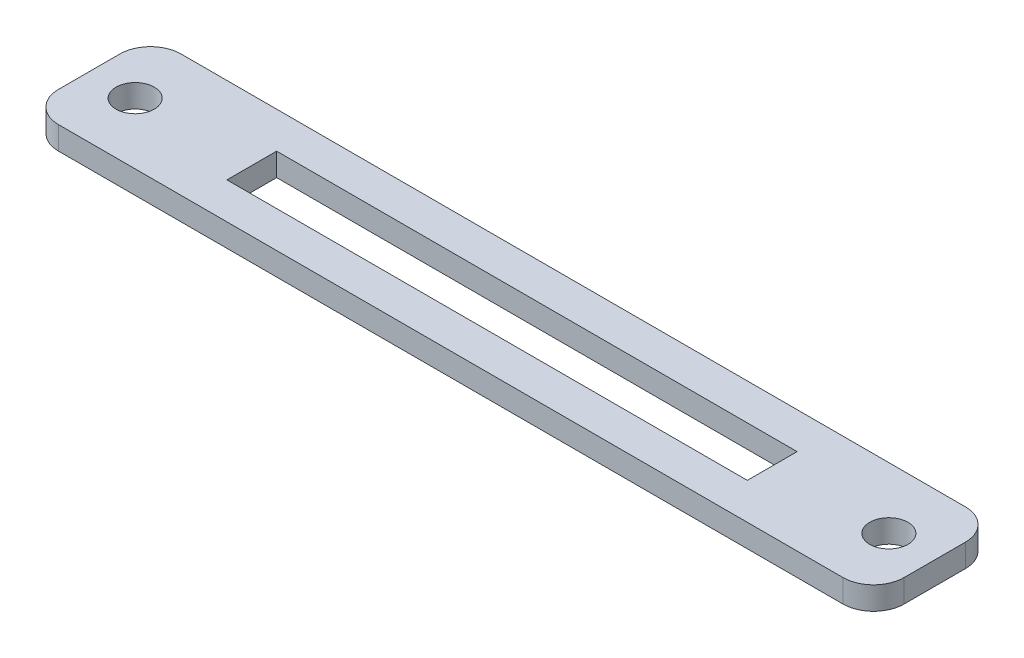
ISO-10303-21;
HEADER;
FILE_DESCRIPTION(('STEP AP214'),'2;1');
FILE_NAME('part.step','',(''),(''),'','','');
FILE_SCHEMA(('AUTOMOTIVE_DESIGN { 1 0 10303 214 1 1 1 1 }'));
ENDSEC;
DATA;
#1=APPLICATION_CONTEXT('core data for automotive mechanical design processes');
#2=APPLICATION_PROTOCOL_DEFINITION('international standard','automotive_design',2000,#1);
#3=PRODUCT_CONTEXT('',#1,'mechanical');
#4=PRODUCT('Part','Part','',(#3));
#5=PRODUCT_RELATED_PRODUCT_CATEGORY('part','',(#4));
#6=PRODUCT_DEFINITION_FORMATION('','',#4);
#7=PRODUCT_DEFINITION_CONTEXT('part definition',#1,'design');
#8=PRODUCT_DEFINITION('design','',#6,#7);
#9=PRODUCT_DEFINITION_SHAPE('','',#8);
#10=(LENGTH_UNIT() NAMED_UNIT(*) SI_UNIT(.MILLI.,.METRE.));
#11=(NAMED_UNIT(*) PLANE_ANGLE_UNIT() SI_UNIT($,.RADIAN.));
#12=(NAMED_UNIT(*) SI_UNIT($,.STERADIAN.) SOLID_ANGLE_UNIT());
#13=UNCERTAINTY_MEASURE_WITH_UNIT(LENGTH_MEASURE(1.E-05),#10,'distance_accuracy_value','');
#14=(GEOMETRIC_REPRESENTATION_CONTEXT(3) GLOBAL_UNCERTAINTY_ASSIGNED_CONTEXT((#13)) GLOBAL_UNIT_ASSIGNED_CONTEXT((#10,
#11,#12)) REPRESENTATION_CONTEXT('',''));
#15=CARTESIAN_POINT('',(0.,0.,0.));
#16=DIRECTION('',(0.,0.,1.));
#17=DIRECTION('',(1.,0.,0.));
#18=AXIS2_PLACEMENT_3D('',#15,#16,#17);
#19=CARTESIAN_POINT('',(0.,-1.5,-7.99999999999999));
#20=DIRECTION('',(0.,0.,-1.));
#21=DIRECTION('',(-1.,0.,0.));
#22=AXIS2_PLACEMENT_3D('',#19,#20,#21);
#23=PLANE('',#22);
#24=DIRECTION('',(-1.,0.,0.));
#25=VECTOR('',#24,1.);
#26=CARTESIAN_POINT('',(0.,-1.5,-7.99999999999999));
#27=LINE('',#26,#25);
#28=CARTESIAN_POINT('',(44.1199111843078,-1.5,-7.99999999999999));
#29=VERTEX_POINT('',#28);
#30=CARTESIAN_POINT('',(-7.11991118430777,-1.5,-7.99999999999999));
#31=VERTEX_POINT('',#30);
#32=EDGE_CURVE('E223',#29,#31,#27,.T.);
#33=ORIENTED_EDGE('',*,*,#32,.T.);
#34=DIRECTION('',(0.,-1.,0.));
#35=VECTOR('',#34,1.);
#36=CARTESIAN_POINT('',(-7.11991118430776,0.,-7.99999999999999));
#37=LINE('',#36,#35);
#38=CARTESIAN_POINT('',(-7.11991118430776,0.,-7.99999999999999));
#39=VERTEX_POINT('',#38);
#40=EDGE_CURVE('E246',#31,#39,#37,.F.);
#41=ORIENTED_EDGE('',*,*,#40,.T.);
#42=DIRECTION('',(-1.,0.,0.));
#43=VECTOR('',#42,1.);
#44=CARTESIAN_POINT('',(0.,0.,-7.99999999999999));
#45=LINE('',#44,#43);
#46=CARTESIAN_POINT('',(44.1199111843077,0.,-7.99999999999999));
#47=VERTEX_POINT('',#46);
#48=EDGE_CURVE('E224',#47,#39,#45,.T.);
#49=ORIENTED_EDGE('',*,*,#48,.F.);
#50=DIRECTION('',(0.,-1.,0.));
#51=VECTOR('',#50,1.);
#52=CARTESIAN_POINT('',(44.1199111843078,-1.49999999999998,-8.));
#53=LINE('',#52,#51);
#54=EDGE_CURVE('E243',#47,#29,#53,.T.);
#55=ORIENTED_EDGE('',*,*,#54,.T.);
#56=EDGE_LOOP('',(#33,#41,#49,#55));
#57=FACE_BOUND('',#56,.T.);
#58=ADVANCED_FACE('F82',(#57),#23,.T.);
#59=CARTESIAN_POINT('',(0.,-1.5,0.));
#60=DIRECTION('',(0.,0.,1.));
#61=DIRECTION('',(1.,0.,0.));
#62=AXIS2_PLACEMENT_3D('',#59,#60,#61);
#63=PLANE('',#62);
#64=DIRECTION('',(1.,0.,0.));
#65=VECTOR('',#64,1.);
#66=CARTESIAN_POINT('',(0.,0.,0.));
#67=LINE('',#66,#65);
#68=CARTESIAN_POINT('',(-7.11991118430776,0.,0.));
#69=VERTEX_POINT('',#68);
#70=CARTESIAN_POINT('',(44.1199111843077,0.,0.));
#71=VERTEX_POINT('',#70);
#72=EDGE_CURVE('E216',#69,#71,#67,.T.);
#73=ORIENTED_EDGE('',*,*,#72,.F.);
#74=DIRECTION('',(0.,-1.,0.));
#75=VECTOR('',#74,1.);
#76=CARTESIAN_POINT('',(-7.11991118430777,-1.49999999999998,0.));
#77=LINE('',#76,#75);
#78=CARTESIAN_POINT('',(-7.11991118430777,-1.5,0.));
#79=VERTEX_POINT('',#78);
#80=EDGE_CURVE('E257',#69,#79,#77,.T.);
#81=ORIENTED_EDGE('',*,*,#80,.T.);
#82=DIRECTION('',(1.,0.,0.));
#83=VECTOR('',#82,1.);
#84=CARTESIAN_POINT('',(0.,-1.5,0.));
#85=LINE('',#84,#83);
#86=CARTESIAN_POINT('',(44.1199111843078,-1.5,0.));
#87=VERTEX_POINT('',#86);
#88=EDGE_CURVE('E220',#79,#87,#85,.T.);
#89=ORIENTED_EDGE('',*,*,#88,.T.);
#90=DIRECTION('',(0.,-1.,0.));
#91=VECTOR('',#90,1.);
#92=CARTESIAN_POINT('',(44.1199111843077,0.,0.));
#93=LINE('',#92,#91);
#94=EDGE_CURVE('E255',#87,#71,#93,.F.);
#95=ORIENTED_EDGE('',*,*,#94,.T.);
#96=EDGE_LOOP('',(#73,#81,#89,#95));
#97=FACE_BOUND('',#96,.T.);
#98=ADVANCED_FACE('F263',(#97),#63,.T.);
#99=CARTESIAN_POINT('',(0.,-1.5,0.));
#100=DIRECTION('',(0.,-1.,0.));
#101=DIRECTION('',(0.,0.,-1.));
#102=AXIS2_PLACEMENT_3D('',#99,#100,#101);
#103=PLANE('',#102);
#104=DIRECTION('',(0.,0.,-1.));
#105=VECTOR('',#104,1.);
#106=CARTESIAN_POINT('',(35.5,-1.5,-5.62499999999999));
#107=LINE('',#106,#105);
#108=CARTESIAN_POINT('',(35.5,-1.5,-2.37499999999999));
#109=VERTEX_POINT('',#108);
#110=CARTESIAN_POINT('',(35.5,-1.5,-5.62499999999999));
#111=VERTEX_POINT('',#110);
#112=EDGE_CURVE('E176',#109,#111,#107,.T.);
#113=ORIENTED_EDGE('',*,*,#112,.T.);
#114=DIRECTION('',(-1.,0.,0.));
#115=VECTOR('',#114,1.);
#116=CARTESIAN_POINT('',(1.49999999999999,-1.5,-5.62499999999999));
#117=LINE('',#116,#115);
#118=CARTESIAN_POINT('',(1.49999999999999,-1.5,-5.62499999999999));
#119=VERTEX_POINT('',#118);
#120=EDGE_CURVE('E188',#111,#119,#117,.T.);
#121=ORIENTED_EDGE('',*,*,#120,.T.);
#122=DIRECTION('',(0.,0.,1.));
#123=VECTOR('',#122,1.);
#124=CARTESIAN_POINT('',(1.49999999999999,-1.5,-5.62499999999999));
#125=LINE('',#124,#123);
#126=CARTESIAN_POINT('',(1.49999999999999,-1.5,-2.37499999999999));
#127=VERTEX_POINT('',#126);
#128=EDGE_CURVE('E192',#119,#127,#125,.T.);
#129=ORIENTED_EDGE('',*,*,#128,.T.);
#130=DIRECTION('',(1.,0.,0.));
#131=VECTOR('',#130,1.);
#132=CARTESIAN_POINT('',(1.49999999999999,-1.5,-2.37499999999999));
#133=LINE('',#132,#131);
#134=EDGE_CURVE('E184',#127,#109,#133,.T.);
#135=ORIENTED_EDGE('',*,*,#134,.T.);
#136=EDGE_LOOP('',(#113,#121,#129,#135));
#137=FACE_BOUND('',#136,.T.);
#138=DIRECTION('',(0.,0.,-1.));
#139=VECTOR('',#138,1.);
#140=CARTESIAN_POINT('',(-9.11991118430777,-1.49999999999996,0.));
#141=LINE('',#140,#139);
#142=CARTESIAN_POINT('',(-9.11991118430777,-1.49999999999996,-5.99999999999999));
#143=VERTEX_POINT('',#142);
#144=CARTESIAN_POINT('',(-9.11991118430777,-1.49999999999996,-2.));
#145=VERTEX_POINT('',#144);
#146=EDGE_CURVE('E282',#143,#145,#141,.F.);
#147=ORIENTED_EDGE('',*,*,#146,.F.);
#148=CARTESIAN_POINT('',(-7.11991118430777,-1.5,-5.99999999999999));
#149=DIRECTION('',(0.,-1.,0.));
#150=DIRECTION('',(0.,0.,-1.));
#151=AXIS2_PLACEMENT_3D('',#148,#149,#150);
#152=CIRCLE('',#151,2.);
#153=EDGE_CURVE('E241',#143,#31,#152,.T.);
#154=ORIENTED_EDGE('',*,*,#153,.T.);
#155=ORIENTED_EDGE('',*,*,#32,.F.);
#156=CARTESIAN_POINT('',(44.1199111843078,-1.5,-6.));
#157=DIRECTION('',(0.,-1.,0.));
#158=DIRECTION('',(0.,0.,-1.));
#159=AXIS2_PLACEMENT_3D('',#156,#157,#158);
#160=CIRCLE('',#159,2.);
#161=CARTESIAN_POINT('',(46.1199111843078,-1.49999999999997,-6.));
#162=VERTEX_POINT('',#161);
#163=EDGE_CURVE('E235',#29,#162,#160,.T.);
#164=ORIENTED_EDGE('',*,*,#163,.T.);
#165=DIRECTION('',(0.,0.,1.));
#166=VECTOR('',#165,1.);
#167=CARTESIAN_POINT('',(46.1199111843078,-1.49999999999997,-8.));
#168=LINE('',#167,#166);
#169=CARTESIAN_POINT('',(46.1199111843078,-1.49999999999997,-1.99999999999999));
#170=VERTEX_POINT('',#169);
#171=EDGE_CURVE('E203',#170,#162,#168,.F.);
#172=ORIENTED_EDGE('',*,*,#171,.F.);
#173=CARTESIAN_POINT('',(44.1199111843078,-1.5,-1.99999999999999));
#174=DIRECTION('',(0.,-1.,0.));
#175=DIRECTION('',(0.,0.,-1.));
#176=AXIS2_PLACEMENT_3D('',#173,#174,#175);
#177=CIRCLE('',#176,2.);
#178=EDGE_CURVE('E237',#170,#87,#177,.T.);
#179=ORIENTED_EDGE('',*,*,#178,.T.);
#180=ORIENTED_EDGE('',*,*,#88,.F.);
#181=CARTESIAN_POINT('',(-7.11991118430777,-1.5,-2.));
#182=DIRECTION('',(0.,-1.,0.));
#183=DIRECTION('',(0.,0.,-1.));
#184=AXIS2_PLACEMENT_3D('',#181,#182,#183);
#185=CIRCLE('',#184,2.);
#186=EDGE_CURVE('E239',#79,#145,#185,.T.);
#187=ORIENTED_EDGE('',*,*,#186,.T.);
#188=EDGE_LOOP('',(#147,#154,#155,#164,#172,#179,#180,#187));
#189=FACE_BOUND('',#188,.T.);
#190=CARTESIAN_POINT('',(43.1199111843078,-1.49999999999999,-4.));
#191=DIRECTION('',(0.,-1.,0.));
#192=DIRECTION('',(1.,0.,0.));
#193=AXIS2_PLACEMENT_3D('',#190,#191,#192);
#194=CIRCLE('',#193,1.24999999999999);
#195=CARTESIAN_POINT('',(44.3699111843077,-1.49999999999998,-4.));
#196=VERTEX_POINT('',#195);
#197=EDGE_CURVE('E279',#196,#196,#194,.T.);
#198=ORIENTED_EDGE('',*,*,#197,.F.);
#199=EDGE_LOOP('',(#198));
#200=FACE_BOUND('',#199,.T.);
#201=CARTESIAN_POINT('',(-6.11991118430776,-1.49999999999998,-4.));
#202=DIRECTION('',(0.,-1.,0.));
#203=DIRECTION('',(1.,0.,0.));
#204=AXIS2_PLACEMENT_3D('',#201,#202,#203);
#205=CIRCLE('',#204,1.24999999999999);
#206=CARTESIAN_POINT('',(-4.86991118430777,-1.49999999999999,-4.));
#207=VERTEX_POINT('',#206);
#208=EDGE_CURVE('E293',#207,#207,#205,.T.);
#209=ORIENTED_EDGE('',*,*,#208,.F.);
#210=EDGE_LOOP('',(#209));
#211=FACE_BOUND('',#210,.T.);
#212=ADVANCED_FACE('F194',(#137,#189,#200,#211),#103,.T.);
#213=CARTESIAN_POINT('',(0.,0.,0.));
#214=DIRECTION('',(0.,-1.,0.));
#215=DIRECTION('',(0.,0.,-1.));
#216=AXIS2_PLACEMENT_3D('',#213,#214,#215);
#217=PLANE('',#216);
#218=DIRECTION('',(-1.,0.,0.));
#219=VECTOR('',#218,1.);
#220=CARTESIAN_POINT('',(1.49999999999999,0.,-5.62499999999999));
#221=LINE('',#220,#219);
#222=CARTESIAN_POINT('',(35.5,0.,-5.62499999999999));
#223=VERTEX_POINT('',#222);
#224=CARTESIAN_POINT('',(1.49999999999999,0.,-5.62499999999999));
#225=VERTEX_POINT('',#224);
#226=EDGE_CURVE('E209',#223,#225,#221,.T.);
#227=ORIENTED_EDGE('',*,*,#226,.F.);
#228=DIRECTION('',(0.,0.,-1.));
#229=VECTOR('',#228,1.);
#230=CARTESIAN_POINT('',(35.5,0.,-5.62499999999999));
#231=LINE('',#230,#229);
#232=CARTESIAN_POINT('',(35.5,0.,-2.37499999999999));
#233=VERTEX_POINT('',#232);
#234=EDGE_CURVE('E179',#233,#223,#231,.T.);
#235=ORIENTED_EDGE('',*,*,#234,.F.);
#236=DIRECTION('',(1.,0.,0.));
#237=VECTOR('',#236,1.);
#238=CARTESIAN_POINT('',(1.49999999999999,0.,-2.37499999999999));
#239=LINE('',#238,#237);
#240=CARTESIAN_POINT('',(1.49999999999999,0.,-2.37499999999999));
#241=VERTEX_POINT('',#240);
#242=EDGE_CURVE('E197',#241,#233,#239,.T.);
#243=ORIENTED_EDGE('',*,*,#242,.F.);
#244=DIRECTION('',(0.,0.,1.));
#245=VECTOR('',#244,1.);
#246=CARTESIAN_POINT('',(1.49999999999999,0.,-5.62499999999999));
#247=LINE('',#246,#245);
#248=EDGE_CURVE('E200',#225,#241,#247,.T.);
#249=ORIENTED_EDGE('',*,*,#248,.F.);
#250=EDGE_LOOP('',(#227,#235,#243,#249));
#251=FACE_BOUND('',#250,.T.);
#252=ORIENTED_EDGE('',*,*,#48,.T.);
#253=CARTESIAN_POINT('',(-7.11991118430776,0.,-5.99999999999999));
#254=DIRECTION('',(0.,-1.,0.));
#255=DIRECTION('',(0.,0.,-1.));
#256=AXIS2_PLACEMENT_3D('',#253,#254,#255);
#257=CIRCLE('',#256,2.);
#258=CARTESIAN_POINT('',(-9.11991118430776,0.,-5.99999999999999));
#259=VERTEX_POINT('',#258);
#260=EDGE_CURVE('E253',#39,#259,#257,.F.);
#261=ORIENTED_EDGE('',*,*,#260,.T.);
#262=DIRECTION('',(0.,0.,1.));
#263=VECTOR('',#262,1.);
#264=CARTESIAN_POINT('',(-9.11991118430776,0.,0.));
#265=LINE('',#264,#263);
#266=CARTESIAN_POINT('',(-9.11991118430776,0.,-2.));
#267=VERTEX_POINT('',#266);
#268=EDGE_CURVE('E287',#259,#267,#265,.T.);
#269=ORIENTED_EDGE('',*,*,#268,.T.);
#270=CARTESIAN_POINT('',(-7.11991118430776,0.,-2.));
#271=DIRECTION('',(0.,-1.,0.));
#272=DIRECTION('',(0.,0.,-1.));
#273=AXIS2_PLACEMENT_3D('',#270,#271,#272);
#274=CIRCLE('',#273,2.);
#275=EDGE_CURVE('E251',#267,#69,#274,.F.);
#276=ORIENTED_EDGE('',*,*,#275,.T.);
#277=ORIENTED_EDGE('',*,*,#72,.T.);
#278=CARTESIAN_POINT('',(44.1199111843077,0.,-1.99999999999999));
#279=DIRECTION('',(0.,-1.,0.));
#280=DIRECTION('',(0.,0.,-1.));
#281=AXIS2_PLACEMENT_3D('',#278,#279,#280);
#282=CIRCLE('',#281,2.);
#283=CARTESIAN_POINT('',(46.1199111843077,0.,-1.99999999999999));
#284=VERTEX_POINT('',#283);
#285=EDGE_CURVE('E103',#71,#284,#282,.F.);
#286=ORIENTED_EDGE('',*,*,#285,.T.);
#287=DIRECTION('',(0.,0.,-1.));
#288=VECTOR('',#287,1.);
#289=CARTESIAN_POINT('',(46.1199111843077,0.,0.));
#290=LINE('',#289,#288);
#291=CARTESIAN_POINT('',(46.1199111843077,0.,-6.));
#292=VERTEX_POINT('',#291);
#293=EDGE_CURVE('E210',#284,#292,#290,.T.);
#294=ORIENTED_EDGE('',*,*,#293,.T.);
#295=CARTESIAN_POINT('',(44.1199111843077,0.,-6.));
#296=DIRECTION('',(0.,-1.,0.));
#297=DIRECTION('',(0.,0.,-1.));
#298=AXIS2_PLACEMENT_3D('',#295,#296,#297);
#299=CIRCLE('',#298,2.);
#300=EDGE_CURVE('E248',#292,#47,#299,.F.);
#301=ORIENTED_EDGE('',*,*,#300,.T.);
#302=EDGE_LOOP('',(#252,#261,#269,#276,#277,#286,#294,#301));
#303=FACE_BOUND('',#302,.T.);
#304=CARTESIAN_POINT('',(43.1199111843077,0.,-4.));
#305=DIRECTION('',(0.,1.,0.));
#306=DIRECTION('',(0.,0.,-1.));
#307=AXIS2_PLACEMENT_3D('',#304,#305,#306);
#308=CIRCLE('',#307,1.24999999999999);
#309=CARTESIAN_POINT('',(43.1199111843077,0.,-5.24999999999999));
#310=VERTEX_POINT('',#309);
#311=EDGE_CURVE('E276',#310,#310,#308,.T.);
#312=ORIENTED_EDGE('',*,*,#311,.F.);
#313=EDGE_LOOP('',(#312));
#314=FACE_BOUND('',#313,.T.);
#315=CARTESIAN_POINT('',(-6.11991118430775,0.,-4.));
#316=DIRECTION('',(0.,-1.,0.));
#317=DIRECTION('',(0.,0.,-1.));
#318=AXIS2_PLACEMENT_3D('',#315,#316,#317);
#319=CIRCLE('',#318,1.24999999999999);
#320=CARTESIAN_POINT('',(-6.11991118430775,0.,-5.24999999999999));
#321=VERTEX_POINT('',#320);
#322=EDGE_CURVE('E289',#321,#321,#319,.T.);
#323=ORIENTED_EDGE('',*,*,#322,.T.);
#324=EDGE_LOOP('',(#323));
#325=FACE_BOUND('',#324,.T.);
#326=ADVANCED_FACE('F303',(#251,#303,#314,#325),#217,.F.);
#327=CARTESIAN_POINT('',(35.5,-1.5,-5.62499999999999));
#328=DIRECTION('',(1.,0.,0.));
#329=DIRECTION('',(0.,0.,-1.));
#330=AXIS2_PLACEMENT_3D('',#327,#328,#329);
#331=PLANE('',#330);
#332=ORIENTED_EDGE('',*,*,#234,.T.);
#333=DIRECTION('',(0.,1.,0.));
#334=VECTOR('',#333,1.);
#335=CARTESIAN_POINT('',(35.5,-1.5,-5.62499999999999));
#336=LINE('',#335,#334);
#337=EDGE_CURVE('E172',#111,#223,#336,.T.);
#338=ORIENTED_EDGE('',*,*,#337,.F.);
#339=ORIENTED_EDGE('',*,*,#112,.F.);
#340=DIRECTION('',(0.,1.,0.));
#341=VECTOR('',#340,1.);
#342=CARTESIAN_POINT('',(35.5,-1.5,-2.37499999999999));
#343=LINE('',#342,#341);
#344=EDGE_CURVE('E214',#109,#233,#343,.T.);
#345=ORIENTED_EDGE('',*,*,#344,.T.);
#346=EDGE_LOOP('',(#332,#338,#339,#345));
#347=FACE_BOUND('',#346,.T.);
#348=ADVANCED_FACE('F174',(#347),#331,.F.);
#349=CARTESIAN_POINT('',(1.49999999999999,-1.5,-2.37499999999999));
#350=DIRECTION('',(0.,0.,1.));
#351=DIRECTION('',(1.,0.,0.));
#352=AXIS2_PLACEMENT_3D('',#349,#350,#351);
#353=PLANE('',#352);
#354=ORIENTED_EDGE('',*,*,#242,.T.);
#355=ORIENTED_EDGE('',*,*,#344,.F.);
#356=ORIENTED_EDGE('',*,*,#134,.F.);
#357=DIRECTION('',(0.,1.,0.));
#358=VECTOR('',#357,1.);
#359=CARTESIAN_POINT('',(1.49999999999999,-1.5,-2.37499999999999));
#360=LINE('',#359,#358);
#361=EDGE_CURVE('E217',#127,#241,#360,.T.);
#362=ORIENTED_EDGE('',*,*,#361,.T.);
#363=EDGE_LOOP('',(#354,#355,#356,#362));
#364=FACE_BOUND('',#363,.T.);
#365=ADVANCED_FACE('F440',(#364),#353,.F.);
#366=CARTESIAN_POINT('',(1.49999999999999,-1.5,-5.62499999999999));
#367=DIRECTION('',(-1.,0.,0.));
#368=DIRECTION('',(0.,0.,1.));
#369=AXIS2_PLACEMENT_3D('',#366,#367,#368);
#370=PLANE('',#369);
#371=ORIENTED_EDGE('',*,*,#248,.T.);
#372=ORIENTED_EDGE('',*,*,#361,.F.);
#373=ORIENTED_EDGE('',*,*,#128,.F.);
#374=DIRECTION('',(0.,1.,0.));
#375=VECTOR('',#374,1.);
#376=CARTESIAN_POINT('',(1.49999999999999,-1.5,-5.62499999999999));
#377=LINE('',#376,#375);
#378=EDGE_CURVE('E183',#119,#225,#377,.T.);
#379=ORIENTED_EDGE('',*,*,#378,.T.);
#380=EDGE_LOOP('',(#371,#372,#373,#379));
#381=FACE_BOUND('',#380,.T.);
#382=ADVANCED_FACE('F430',(#381),#370,.F.);
#383=CARTESIAN_POINT('',(1.49999999999999,-1.5,-5.62499999999999));
#384=DIRECTION('',(0.,0.,-1.));
#385=DIRECTION('',(-1.,0.,0.));
#386=AXIS2_PLACEMENT_3D('',#383,#384,#385);
#387=PLANE('',#386);
#388=ORIENTED_EDGE('',*,*,#226,.T.);
#389=ORIENTED_EDGE('',*,*,#378,.F.);
#390=ORIENTED_EDGE('',*,*,#120,.F.);
#391=ORIENTED_EDGE('',*,*,#337,.T.);
#392=EDGE_LOOP('',(#388,#389,#390,#391));
#393=FACE_BOUND('',#392,.T.);
#394=ADVANCED_FACE('F189',(#393),#387,.F.);
#395=CARTESIAN_POINT('',(46.1199111843077,0.,-8.));
#396=DIRECTION('',(-1.,0.,0.));
#397=DIRECTION('',(0.,-1.,0.));
#398=AXIS2_PLACEMENT_3D('',#395,#396,#397);
#399=PLANE('',#398);
#400=ORIENTED_EDGE('',*,*,#293,.F.);
#401=DIRECTION('',(0.,-1.,0.));
#402=VECTOR('',#401,1.);
#403=CARTESIAN_POINT('',(46.1199111843078,-1.49999999999997,-1.99999999999999));
#404=LINE('',#403,#402);
#405=EDGE_CURVE('E13',#284,#170,#404,.T.);
#406=ORIENTED_EDGE('',*,*,#405,.T.);
#407=ORIENTED_EDGE('',*,*,#171,.T.);
#408=DIRECTION('',(0.,-1.,0.));
#409=VECTOR('',#408,1.);
#410=CARTESIAN_POINT('',(46.1199111843077,0.,-6.));
#411=LINE('',#410,#409);
#412=EDGE_CURVE('E90',#162,#292,#411,.F.);
#413=ORIENTED_EDGE('',*,*,#412,.T.);
#414=EDGE_LOOP('',(#400,#406,#407,#413));
#415=FACE_BOUND('',#414,.T.);
#416=ADVANCED_FACE('F274',(#415),#399,.F.);
#417=CARTESIAN_POINT('',(43.1199111843077,0.,-4.));
#418=DIRECTION('',(0.,1.,0.));
#419=DIRECTION('',(0.,0.,-1.));
#420=AXIS2_PLACEMENT_3D('',#417,#418,#419);
#421=CYLINDRICAL_SURFACE('',#420,1.24999999999999);
#422=ORIENTED_EDGE('',*,*,#197,.T.);
#423=EDGE_LOOP('',(#422));
#424=FACE_BOUND('',#423,.T.);
#425=ORIENTED_EDGE('',*,*,#311,.T.);
#426=EDGE_LOOP('',(#425));
#427=FACE_BOUND('',#426,.T.);
#428=ADVANCED_FACE('F324',(#424,#427),#421,.F.);
#429=CARTESIAN_POINT('',(-9.11991118430776,0.,0.));
#430=DIRECTION('',(1.,0.,0.));
#431=DIRECTION('',(0.,1.,0.));
#432=AXIS2_PLACEMENT_3D('',#429,#430,#431);
#433=PLANE('',#432);
#434=ORIENTED_EDGE('',*,*,#268,.F.);
#435=DIRECTION('',(0.,-1.,0.));
#436=VECTOR('',#435,1.);
#437=CARTESIAN_POINT('',(-9.11991118430777,-1.49999999999996,-5.99999999999999));
#438=LINE('',#437,#436);
#439=EDGE_CURVE('E232',#259,#143,#438,.T.);
#440=ORIENTED_EDGE('',*,*,#439,.T.);
#441=ORIENTED_EDGE('',*,*,#146,.T.);
#442=DIRECTION('',(0.,-1.,0.));
#443=VECTOR('',#442,1.);
#444=CARTESIAN_POINT('',(-9.11991118430776,0.,-2.));
#445=LINE('',#444,#443);
#446=EDGE_CURVE('E227',#145,#267,#445,.F.);
#447=ORIENTED_EDGE('',*,*,#446,.T.);
#448=EDGE_LOOP('',(#434,#440,#441,#447));
#449=FACE_BOUND('',#448,.T.);
#450=ADVANCED_FACE('F300',(#449),#433,.F.);
#451=CARTESIAN_POINT('',(-6.11991118430791,-43.3,-4.));
#452=DIRECTION('',(0.,-1.,0.));
#453=DIRECTION('',(0.,0.,-1.));
#454=AXIS2_PLACEMENT_3D('',#451,#452,#453);
#455=CYLINDRICAL_SURFACE('',#454,1.24999999999999);
#456=ORIENTED_EDGE('',*,*,#208,.T.);
#457=EDGE_LOOP('',(#456));
#458=FACE_BOUND('',#457,.T.);
#459=ORIENTED_EDGE('',*,*,#322,.F.);
#460=EDGE_LOOP('',(#459));
#461=FACE_BOUND('',#460,.T.);
#462=ADVANCED_FACE('F314',(#458,#461),#455,.F.);
#463=CARTESIAN_POINT('',(-7.11991118430776,0.,-5.99999999999999));
#464=DIRECTION('',(0.,1.,0.));
#465=DIRECTION('',(-1.,0.,0.));
#466=AXIS2_PLACEMENT_3D('',#463,#464,#465);
#467=CYLINDRICAL_SURFACE('',#466,2.);
#468=ORIENTED_EDGE('',*,*,#260,.F.);
#469=ORIENTED_EDGE('',*,*,#40,.F.);
#470=ORIENTED_EDGE('',*,*,#153,.F.);
#471=ORIENTED_EDGE('',*,*,#439,.F.);
#472=EDGE_LOOP('',(#468,#469,#470,#471));
#473=FACE_BOUND('',#472,.T.);
#474=ADVANCED_FACE('F316',(#473),#467,.T.);
#475=CARTESIAN_POINT('',(-7.11991118430777,-1.49999999999995,-2.));
#476=DIRECTION('',(0.,1.,0.));
#477=DIRECTION('',(-1.,0.,0.));
#478=AXIS2_PLACEMENT_3D('',#475,#476,#477);
#479=CYLINDRICAL_SURFACE('',#478,2.);
#480=ORIENTED_EDGE('',*,*,#275,.F.);
#481=ORIENTED_EDGE('',*,*,#446,.F.);
#482=ORIENTED_EDGE('',*,*,#186,.F.);
#483=ORIENTED_EDGE('',*,*,#80,.F.);
#484=EDGE_LOOP('',(#480,#481,#482,#483));
#485=FACE_BOUND('',#484,.T.);
#486=ADVANCED_FACE('F302',(#485),#479,.T.);
#487=CARTESIAN_POINT('',(44.1199111843077,0.,-1.99999999999999));
#488=DIRECTION('',(0.,1.,0.));
#489=DIRECTION('',(-1.,0.,0.));
#490=AXIS2_PLACEMENT_3D('',#487,#488,#489);
#491=CYLINDRICAL_SURFACE('',#490,2.);
#492=ORIENTED_EDGE('',*,*,#285,.F.);
#493=ORIENTED_EDGE('',*,*,#94,.F.);
#494=ORIENTED_EDGE('',*,*,#178,.F.);
#495=ORIENTED_EDGE('',*,*,#405,.F.);
#496=EDGE_LOOP('',(#492,#493,#494,#495));
#497=FACE_BOUND('',#496,.T.);
#498=ADVANCED_FACE('F273',(#497),#491,.T.);
#499=CARTESIAN_POINT('',(44.1199111843078,-1.49999999999969,-6.));
#500=DIRECTION('',(0.,1.,0.));
#501=DIRECTION('',(-1.,0.,0.));
#502=AXIS2_PLACEMENT_3D('',#499,#500,#501);
#503=CYLINDRICAL_SURFACE('',#502,2.);
#504=ORIENTED_EDGE('',*,*,#300,.F.);
#505=ORIENTED_EDGE('',*,*,#412,.F.);
#506=ORIENTED_EDGE('',*,*,#163,.F.);
#507=ORIENTED_EDGE('',*,*,#54,.F.);
#508=EDGE_LOOP('',(#504,#505,#506,#507));
#509=FACE_BOUND('',#508,.T.);
#510=ADVANCED_FACE('F84',(#509),#503,.T.);
#511=CLOSED_SHELL('',(#58,#98,#212,#326,#348,#365,#382,#394,#416,#428,#450,#462,#474,#486,#498,#510));
#512=MANIFOLD_SOLID_BREP('B2',#511);
#513=ADVANCED_BREP_SHAPE_REPRESENTATION('',(#18,#512),#14);
#514=SHAPE_DEFINITION_REPRESENTATION(#9,#513);
ENDSEC;
END-ISO-10303-21;
